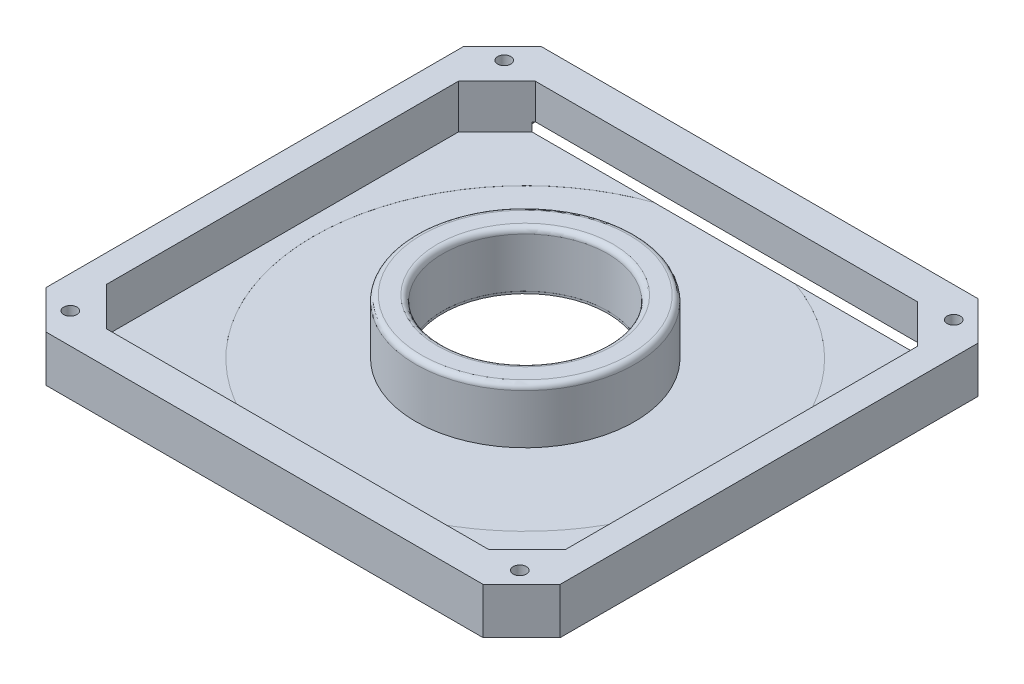
ISO-10303-21;
HEADER;
FILE_DESCRIPTION(('STEP AP214'),'2;1');
FILE_NAME('part.step','',(''),(''),'','','');
FILE_SCHEMA(('AUTOMOTIVE_DESIGN { 1 0 10303 214 1 1 1 1 }'));
ENDSEC;
DATA;
#1=APPLICATION_CONTEXT('core data for automotive mechanical design processes');
#2=APPLICATION_PROTOCOL_DEFINITION('international standard','automotive_design',2000,#1);
#3=PRODUCT_CONTEXT('',#1,'mechanical');
#4=PRODUCT('Part','Part','',(#3));
#5=PRODUCT_RELATED_PRODUCT_CATEGORY('part','',(#4));
#6=PRODUCT_DEFINITION_FORMATION('','',#4);
#7=PRODUCT_DEFINITION_CONTEXT('part definition',#1,'design');
#8=PRODUCT_DEFINITION('design','',#6,#7);
#9=PRODUCT_DEFINITION_SHAPE('','',#8);
#10=(LENGTH_UNIT() NAMED_UNIT(*) SI_UNIT(.MILLI.,.METRE.));
#11=(NAMED_UNIT(*) PLANE_ANGLE_UNIT() SI_UNIT($,.RADIAN.));
#12=(NAMED_UNIT(*) SI_UNIT($,.STERADIAN.) SOLID_ANGLE_UNIT());
#13=UNCERTAINTY_MEASURE_WITH_UNIT(LENGTH_MEASURE(1.E-05),#10,'distance_accuracy_value','');
#14=(GEOMETRIC_REPRESENTATION_CONTEXT(3) GLOBAL_UNCERTAINTY_ASSIGNED_CONTEXT((#13)) GLOBAL_UNIT_ASSIGNED_CONTEXT((#10,
#11,#12)) REPRESENTATION_CONTEXT('',''));
#15=CARTESIAN_POINT('',(0.,0.,0.));
#16=DIRECTION('',(0.,0.,1.));
#17=DIRECTION('',(1.,0.,0.));
#18=AXIS2_PLACEMENT_3D('',#15,#16,#17);
#19=CARTESIAN_POINT('',(-39.75,8.4,-45.));
#20=DIRECTION('',(0.,0.,1.));
#21=DIRECTION('',(1.,0.,0.));
#22=AXIS2_PLACEMENT_3D('',#19,#20,#21);
#23=PLANE('',#22);
#24=DIRECTION('',(0.,1.,0.));
#25=VECTOR('',#24,1.);
#26=CARTESIAN_POINT('',(-36.75,-162.561574872416,-45.));
#27=LINE('',#26,#25);
#28=CARTESIAN_POINT('',(-36.75,0.,-45.));
#29=VERTEX_POINT('',#28);
#30=CARTESIAN_POINT('',(-36.75,1.99999999999997,-45.));
#31=VERTEX_POINT('',#30);
#32=EDGE_CURVE('E322',#29,#31,#27,.T.);
#33=ORIENTED_EDGE('',*,*,#32,.F.);
#34=DIRECTION('',(-1.,0.,0.));
#35=VECTOR('',#34,1.);
#36=CARTESIAN_POINT('',(-39.75,0.,-45.));
#37=LINE('',#36,#35);
#38=CARTESIAN_POINT('',(-39.75,0.,-45.));
#39=VERTEX_POINT('',#38);
#40=EDGE_CURVE('E281',#29,#39,#37,.T.);
#41=ORIENTED_EDGE('',*,*,#40,.T.);
#42=DIRECTION('',(0.,-1.,0.));
#43=VECTOR('',#42,1.);
#44=CARTESIAN_POINT('',(-39.75,8.4,-45.));
#45=LINE('',#44,#43);
#46=CARTESIAN_POINT('',(-39.75,8.4,-45.));
#47=VERTEX_POINT('',#46);
#48=EDGE_CURVE('E282',#47,#39,#45,.T.);
#49=ORIENTED_EDGE('',*,*,#48,.F.);
#50=DIRECTION('',(-1.,0.,0.));
#51=VECTOR('',#50,1.);
#52=CARTESIAN_POINT('',(-39.75,8.4,-45.));
#53=LINE('',#52,#51);
#54=CARTESIAN_POINT('',(39.75,8.4,-45.));
#55=VERTEX_POINT('',#54);
#56=EDGE_CURVE('E305',#55,#47,#53,.T.);
#57=ORIENTED_EDGE('',*,*,#56,.F.);
#58=DIRECTION('',(0.,-1.,0.));
#59=VECTOR('',#58,1.);
#60=CARTESIAN_POINT('',(39.75,8.4,-45.));
#61=LINE('',#60,#59);
#62=CARTESIAN_POINT('',(39.75,0.,-45.));
#63=VERTEX_POINT('',#62);
#64=EDGE_CURVE('E277',#55,#63,#61,.T.);
#65=ORIENTED_EDGE('',*,*,#64,.T.);
#66=CARTESIAN_POINT('',(36.75,0.,-45.));
#67=VERTEX_POINT('',#66);
#68=EDGE_CURVE('E280',#63,#67,#37,.T.);
#69=ORIENTED_EDGE('',*,*,#68,.T.);
#70=DIRECTION('',(0.,1.,0.));
#71=VECTOR('',#70,1.);
#72=CARTESIAN_POINT('',(36.75,-162.561574872416,-45.));
#73=LINE('',#72,#71);
#74=CARTESIAN_POINT('',(36.75,1.99999999999997,-45.));
#75=VERTEX_POINT('',#74);
#76=EDGE_CURVE('E293',#67,#75,#73,.T.);
#77=ORIENTED_EDGE('',*,*,#76,.T.);
#78=DIRECTION('',(-1.,0.,0.));
#79=VECTOR('',#78,1.);
#80=CARTESIAN_POINT('',(-39.75,2.,-45.));
#81=LINE('',#80,#79);
#82=EDGE_CURVE('E301',#75,#31,#81,.T.);
#83=ORIENTED_EDGE('',*,*,#82,.T.);
#84=EDGE_LOOP('',(#33,#41,#49,#57,#65,#69,#77,#83));
#85=FACE_BOUND('',#84,.T.);
#86=ADVANCED_FACE('F44',(#85),#23,.F.);
#87=CARTESIAN_POINT('',(0.,0.,0.));
#88=DIRECTION('',(0.,-1.,0.));
#89=DIRECTION('',(0.,0.,-1.));
#90=AXIS2_PLACEMENT_3D('',#87,#88,#89);
#91=PLANE('',#90);
#92=CARTESIAN_POINT('',(0.,0.,-2.404788));
#93=DIRECTION('',(0.,1.,0.));
#94=DIRECTION('',(0.,0.,1.));
#95=AXIS2_PLACEMENT_3D('',#92,#93,#94);
#96=CIRCLE('',#95,15.);
#97=CARTESIAN_POINT('',(0.,0.,12.595212));
#98=VERTEX_POINT('',#97);
#99=EDGE_CURVE('E520',#98,#98,#96,.T.);
#100=ORIENTED_EDGE('',*,*,#99,.T.);
#101=EDGE_LOOP('',(#100));
#102=FACE_BOUND('',#101,.T.);
#103=CARTESIAN_POINT('',(40.8711804126844,0.,39.4578599479724));
#104=DIRECTION('',(0.,-1.,0.));
#105=DIRECTION('',(0.,0.,-1.));
#106=AXIS2_PLACEMENT_3D('',#103,#104,#105);
#107=CIRCLE('',#106,1.19999999999999);
#108=CARTESIAN_POINT('',(40.8711804126844,0.,38.2578599479724));
#109=VERTEX_POINT('',#108);
#110=EDGE_CURVE('E514',#109,#109,#107,.T.);
#111=ORIENTED_EDGE('',*,*,#110,.F.);
#112=EDGE_LOOP('',(#111));
#113=FACE_BOUND('',#112,.T.);
#114=CARTESIAN_POINT('',(-40.8711804126844,0.,39.4578599479724));
#115=DIRECTION('',(0.,-1.,0.));
#116=DIRECTION('',(0.,0.,-1.));
#117=AXIS2_PLACEMENT_3D('',#114,#115,#116);
#118=CIRCLE('',#117,1.19999999999999);
#119=CARTESIAN_POINT('',(-40.8711804126844,0.,38.2578599479724));
#120=VERTEX_POINT('',#119);
#121=EDGE_CURVE('E508',#120,#120,#118,.T.);
#122=ORIENTED_EDGE('',*,*,#121,.F.);
#123=EDGE_LOOP('',(#122));
#124=FACE_BOUND('',#123,.T.);
#125=CARTESIAN_POINT('',(-40.8711804126844,0.,-39.4578599479724));
#126=DIRECTION('',(0.,-1.,0.));
#127=DIRECTION('',(0.,0.,-1.));
#128=AXIS2_PLACEMENT_3D('',#125,#126,#127);
#129=CIRCLE('',#128,1.19999999999999);
#130=CARTESIAN_POINT('',(-40.8711804126844,0.,-40.6578599479724));
#131=VERTEX_POINT('',#130);
#132=EDGE_CURVE('E500',#131,#131,#129,.T.);
#133=ORIENTED_EDGE('',*,*,#132,.F.);
#134=EDGE_LOOP('',(#133));
#135=FACE_BOUND('',#134,.T.);
#136=CARTESIAN_POINT('',(40.8711804126844,0.,-39.4578599479724));
#137=DIRECTION('',(0.,-1.,0.));
#138=DIRECTION('',(0.,0.,-1.));
#139=AXIS2_PLACEMENT_3D('',#136,#137,#138);
#140=CIRCLE('',#139,1.19999999999999);
#141=CARTESIAN_POINT('',(40.8711804126844,0.,-40.6578599479724));
#142=VERTEX_POINT('',#141);
#143=EDGE_CURVE('E494',#142,#142,#140,.T.);
#144=ORIENTED_EDGE('',*,*,#143,.F.);
#145=EDGE_LOOP('',(#144));
#146=FACE_BOUND('',#145,.T.);
#147=ORIENTED_EDGE('',*,*,#40,.F.);
#148=DIRECTION('',(0.,0.,-1.));
#149=VECTOR('',#148,1.);
#150=CARTESIAN_POINT('',(-36.75,0.,-39.7047880243918));
#151=LINE('',#150,#149);
#152=CARTESIAN_POINT('',(-36.75,0.,-39.7047880243918));
#153=VERTEX_POINT('',#152);
#154=EDGE_CURVE('E304',#153,#29,#151,.T.);
#155=ORIENTED_EDGE('',*,*,#154,.F.);
#156=CARTESIAN_POINT('',(-35.75,0.,-39.7047880243918));
#157=DIRECTION('',(0.,-1.,0.));
#158=DIRECTION('',(0.,0.,-1.));
#159=AXIS2_PLACEMENT_3D('',#156,#157,#158);
#160=CIRCLE('',#159,0.999999999999997);
#161=CARTESIAN_POINT('',(-35.75,0.,-38.7047880243918));
#162=VERTEX_POINT('',#161);
#163=EDGE_CURVE('E326',#162,#153,#160,.T.);
#164=ORIENTED_EDGE('',*,*,#163,.F.);
#165=DIRECTION('',(-1.,0.,0.));
#166=VECTOR('',#165,1.);
#167=CARTESIAN_POINT('',(35.75,0.,-38.7047880243918));
#168=LINE('',#167,#166);
#169=CARTESIAN_POINT('',(35.75,0.,-38.7047880243918));
#170=VERTEX_POINT('',#169);
#171=EDGE_CURVE('E333',#170,#162,#168,.T.);
#172=ORIENTED_EDGE('',*,*,#171,.F.);
#173=CARTESIAN_POINT('',(35.75,0.,-39.7047880243918));
#174=DIRECTION('',(0.,-1.,0.));
#175=DIRECTION('',(0.,0.,-1.));
#176=AXIS2_PLACEMENT_3D('',#173,#174,#175);
#177=CIRCLE('',#176,1.);
#178=CARTESIAN_POINT('',(36.75,0.,-39.7047880243918));
#179=VERTEX_POINT('',#178);
#180=EDGE_CURVE('E332',#179,#170,#177,.T.);
#181=ORIENTED_EDGE('',*,*,#180,.F.);
#182=DIRECTION('',(0.,0.,1.));
#183=VECTOR('',#182,1.);
#184=CARTESIAN_POINT('',(36.75,0.,-45.));
#185=LINE('',#184,#183);
#186=EDGE_CURVE('E337',#67,#179,#185,.T.);
#187=ORIENTED_EDGE('',*,*,#186,.F.);
#188=ORIENTED_EDGE('',*,*,#68,.F.);
#189=DIRECTION('',(-0.707106781186547,0.,-0.707106781186547));
#190=VECTOR('',#189,1.);
#191=CARTESIAN_POINT('',(39.75,0.,-45.));
#192=LINE('',#191,#190);
#193=CARTESIAN_POINT('',(46.75,0.,-38.));
#194=VERTEX_POINT('',#193);
#195=EDGE_CURVE('E272',#194,#63,#192,.T.);
#196=ORIENTED_EDGE('',*,*,#195,.F.);
#197=DIRECTION('',(0.,0.,-1.));
#198=VECTOR('',#197,1.);
#199=CARTESIAN_POINT('',(46.75,0.,38.));
#200=LINE('',#199,#198);
#201=CARTESIAN_POINT('',(46.75,0.,38.));
#202=VERTEX_POINT('',#201);
#203=EDGE_CURVE('E268',#202,#194,#200,.T.);
#204=ORIENTED_EDGE('',*,*,#203,.F.);
#205=DIRECTION('',(0.707106781186548,0.,-0.707106781186547));
#206=VECTOR('',#205,1.);
#207=CARTESIAN_POINT('',(39.75,0.,45.));
#208=LINE('',#207,#206);
#209=CARTESIAN_POINT('',(39.75,0.,45.));
#210=VERTEX_POINT('',#209);
#211=EDGE_CURVE('E264',#210,#202,#208,.T.);
#212=ORIENTED_EDGE('',*,*,#211,.F.);
#213=DIRECTION('',(1.,0.,0.));
#214=VECTOR('',#213,1.);
#215=CARTESIAN_POINT('',(-39.75,0.,45.));
#216=LINE('',#215,#214);
#217=CARTESIAN_POINT('',(-39.75,0.,45.));
#218=VERTEX_POINT('',#217);
#219=EDGE_CURVE('E259',#218,#210,#216,.T.);
#220=ORIENTED_EDGE('',*,*,#219,.F.);
#221=DIRECTION('',(0.707106781186547,0.,0.707106781186547));
#222=VECTOR('',#221,1.);
#223=CARTESIAN_POINT('',(-39.75,0.,45.));
#224=LINE('',#223,#222);
#225=CARTESIAN_POINT('',(-46.75,0.,38.));
#226=VERTEX_POINT('',#225);
#227=EDGE_CURVE('E260',#226,#218,#224,.T.);
#228=ORIENTED_EDGE('',*,*,#227,.F.);
#229=DIRECTION('',(0.,0.,1.));
#230=VECTOR('',#229,1.);
#231=CARTESIAN_POINT('',(-46.75,0.,38.));
#232=LINE('',#231,#230);
#233=CARTESIAN_POINT('',(-46.75,0.,-38.));
#234=VERTEX_POINT('',#233);
#235=EDGE_CURVE('E289',#234,#226,#232,.T.);
#236=ORIENTED_EDGE('',*,*,#235,.F.);
#237=DIRECTION('',(-0.707106781186547,0.,0.707106781186547));
#238=VECTOR('',#237,1.);
#239=CARTESIAN_POINT('',(-46.75,0.,-38.));
#240=LINE('',#239,#238);
#241=EDGE_CURVE('E276',#39,#234,#240,.T.);
#242=ORIENTED_EDGE('',*,*,#241,.F.);
#243=EDGE_LOOP('',(#147,#155,#164,#172,#181,#187,#188,#196,#204,#212,#220,#228,#236,#242));
#244=FACE_BOUND('',#243,.T.);
#245=ADVANCED_FACE('F453',(#102,#113,#124,#135,#146,#244),#91,.T.);
#246=CARTESIAN_POINT('',(-46.75,8.4,38.));
#247=DIRECTION('',(1.,0.,0.));
#248=DIRECTION('',(0.,0.,-1.));
#249=AXIS2_PLACEMENT_3D('',#246,#247,#248);
#250=PLANE('',#249);
#251=ORIENTED_EDGE('',*,*,#235,.T.);
#252=DIRECTION('',(0.,-1.,0.));
#253=VECTOR('',#252,1.);
#254=CARTESIAN_POINT('',(-46.75,8.4,38.));
#255=LINE('',#254,#253);
#256=CARTESIAN_POINT('',(-46.75,8.4,38.));
#257=VERTEX_POINT('',#256);
#258=EDGE_CURVE('E256',#257,#226,#255,.T.);
#259=ORIENTED_EDGE('',*,*,#258,.F.);
#260=DIRECTION('',(0.,0.,1.));
#261=VECTOR('',#260,1.);
#262=CARTESIAN_POINT('',(-46.75,8.4,38.));
#263=LINE('',#262,#261);
#264=CARTESIAN_POINT('',(-46.75,8.4,-38.));
#265=VERTEX_POINT('',#264);
#266=EDGE_CURVE('E285',#265,#257,#263,.T.);
#267=ORIENTED_EDGE('',*,*,#266,.F.);
#268=DIRECTION('',(0.,-1.,0.));
#269=VECTOR('',#268,1.);
#270=CARTESIAN_POINT('',(-46.75,8.4,-38.));
#271=LINE('',#270,#269);
#272=EDGE_CURVE('E286',#265,#234,#271,.T.);
#273=ORIENTED_EDGE('',*,*,#272,.T.);
#274=EDGE_LOOP('',(#251,#259,#267,#273));
#275=FACE_BOUND('',#274,.T.);
#276=ADVANCED_FACE('F487',(#275),#250,.F.);
#277=CARTESIAN_POINT('',(-39.75,8.4,45.));
#278=DIRECTION('',(0.707106781186548,0.,-0.707106781186548));
#279=DIRECTION('',(-0.707106781186548,0.,-0.707106781186548));
#280=AXIS2_PLACEMENT_3D('',#277,#278,#279);
#281=PLANE('',#280);
#282=ORIENTED_EDGE('',*,*,#227,.T.);
#283=DIRECTION('',(0.,-1.,0.));
#284=VECTOR('',#283,1.);
#285=CARTESIAN_POINT('',(-39.75,8.4,45.));
#286=LINE('',#285,#284);
#287=CARTESIAN_POINT('',(-39.75,8.4,45.));
#288=VERTEX_POINT('',#287);
#289=EDGE_CURVE('E261',#288,#218,#286,.T.);
#290=ORIENTED_EDGE('',*,*,#289,.F.);
#291=DIRECTION('',(0.707106781186547,0.,0.707106781186547));
#292=VECTOR('',#291,1.);
#293=CARTESIAN_POINT('',(-39.75,8.4,45.));
#294=LINE('',#293,#292);
#295=EDGE_CURVE('E315',#257,#288,#294,.T.);
#296=ORIENTED_EDGE('',*,*,#295,.F.);
#297=ORIENTED_EDGE('',*,*,#258,.T.);
#298=EDGE_LOOP('',(#282,#290,#296,#297));
#299=FACE_BOUND('',#298,.T.);
#300=ADVANCED_FACE('F484',(#299),#281,.F.);
#301=CARTESIAN_POINT('',(-39.75,8.4,45.));
#302=DIRECTION('',(0.,0.,-1.));
#303=DIRECTION('',(-1.,0.,0.));
#304=AXIS2_PLACEMENT_3D('',#301,#302,#303);
#305=PLANE('',#304);
#306=ORIENTED_EDGE('',*,*,#219,.T.);
#307=DIRECTION('',(0.,-1.,0.));
#308=VECTOR('',#307,1.);
#309=CARTESIAN_POINT('',(39.75,8.4,45.));
#310=LINE('',#309,#308);
#311=CARTESIAN_POINT('',(39.75,8.4,45.));
#312=VERTEX_POINT('',#311);
#313=EDGE_CURVE('E265',#312,#210,#310,.T.);
#314=ORIENTED_EDGE('',*,*,#313,.F.);
#315=DIRECTION('',(1.,0.,0.));
#316=VECTOR('',#315,1.);
#317=CARTESIAN_POINT('',(-39.75,8.4,45.));
#318=LINE('',#317,#316);
#319=EDGE_CURVE('E313',#288,#312,#318,.T.);
#320=ORIENTED_EDGE('',*,*,#319,.F.);
#321=ORIENTED_EDGE('',*,*,#289,.T.);
#322=EDGE_LOOP('',(#306,#314,#320,#321));
#323=FACE_BOUND('',#322,.T.);
#324=ADVANCED_FACE('F478',(#323),#305,.F.);
#325=CARTESIAN_POINT('',(39.75,8.4,45.));
#326=DIRECTION('',(-0.707106781186547,0.,-0.707106781186548));
#327=DIRECTION('',(-0.707106781186548,0.,0.707106781186547));
#328=AXIS2_PLACEMENT_3D('',#325,#326,#327);
#329=PLANE('',#328);
#330=ORIENTED_EDGE('',*,*,#211,.T.);
#331=DIRECTION('',(0.,-1.,0.));
#332=VECTOR('',#331,1.);
#333=CARTESIAN_POINT('',(46.75,8.4,38.));
#334=LINE('',#333,#332);
#335=CARTESIAN_POINT('',(46.75,8.4,38.));
#336=VERTEX_POINT('',#335);
#337=EDGE_CURVE('E269',#336,#202,#334,.T.);
#338=ORIENTED_EDGE('',*,*,#337,.F.);
#339=DIRECTION('',(0.707106781186548,0.,-0.707106781186547));
#340=VECTOR('',#339,1.);
#341=CARTESIAN_POINT('',(39.75,8.4,45.));
#342=LINE('',#341,#340);
#343=EDGE_CURVE('E311',#312,#336,#342,.T.);
#344=ORIENTED_EDGE('',*,*,#343,.F.);
#345=ORIENTED_EDGE('',*,*,#313,.T.);
#346=EDGE_LOOP('',(#330,#338,#344,#345));
#347=FACE_BOUND('',#346,.T.);
#348=ADVANCED_FACE('F474',(#347),#329,.F.);
#349=CARTESIAN_POINT('',(46.75,8.4,38.));
#350=DIRECTION('',(-1.,0.,0.));
#351=DIRECTION('',(0.,0.,1.));
#352=AXIS2_PLACEMENT_3D('',#349,#350,#351);
#353=PLANE('',#352);
#354=ORIENTED_EDGE('',*,*,#203,.T.);
#355=DIRECTION('',(0.,-1.,0.));
#356=VECTOR('',#355,1.);
#357=CARTESIAN_POINT('',(46.75,8.4,-38.));
#358=LINE('',#357,#356);
#359=CARTESIAN_POINT('',(46.75,8.4,-38.));
#360=VERTEX_POINT('',#359);
#361=EDGE_CURVE('E273',#360,#194,#358,.T.);
#362=ORIENTED_EDGE('',*,*,#361,.F.);
#363=DIRECTION('',(0.,0.,-1.));
#364=VECTOR('',#363,1.);
#365=CARTESIAN_POINT('',(46.75,8.4,38.));
#366=LINE('',#365,#364);
#367=EDGE_CURVE('E309',#336,#360,#366,.T.);
#368=ORIENTED_EDGE('',*,*,#367,.F.);
#369=ORIENTED_EDGE('',*,*,#337,.T.);
#370=EDGE_LOOP('',(#354,#362,#368,#369));
#371=FACE_BOUND('',#370,.T.);
#372=ADVANCED_FACE('F469',(#371),#353,.F.);
#373=CARTESIAN_POINT('',(39.75,8.4,-45.));
#374=DIRECTION('',(-0.707106781186548,0.,0.707106781186548));
#375=DIRECTION('',(0.707106781186548,0.,0.707106781186548));
#376=AXIS2_PLACEMENT_3D('',#373,#374,#375);
#377=PLANE('',#376);
#378=ORIENTED_EDGE('',*,*,#195,.T.);
#379=ORIENTED_EDGE('',*,*,#64,.F.);
#380=DIRECTION('',(-0.707106781186547,0.,-0.707106781186547));
#381=VECTOR('',#380,1.);
#382=CARTESIAN_POINT('',(39.75,8.4,-45.));
#383=LINE('',#382,#381);
#384=EDGE_CURVE('E307',#360,#55,#383,.T.);
#385=ORIENTED_EDGE('',*,*,#384,.F.);
#386=ORIENTED_EDGE('',*,*,#361,.T.);
#387=EDGE_LOOP('',(#378,#379,#385,#386));
#388=FACE_BOUND('',#387,.T.);
#389=ADVANCED_FACE('F463',(#388),#377,.F.);
#390=CARTESIAN_POINT('',(-46.75,8.4,-38.));
#391=DIRECTION('',(0.707106781186548,0.,0.707106781186548));
#392=DIRECTION('',(0.707106781186548,0.,-0.707106781186548));
#393=AXIS2_PLACEMENT_3D('',#390,#391,#392);
#394=PLANE('',#393);
#395=ORIENTED_EDGE('',*,*,#241,.T.);
#396=ORIENTED_EDGE('',*,*,#272,.F.);
#397=DIRECTION('',(-0.707106781186547,0.,0.707106781186547));
#398=VECTOR('',#397,1.);
#399=CARTESIAN_POINT('',(-46.75,8.4,-38.));
#400=LINE('',#399,#398);
#401=EDGE_CURVE('E302',#47,#265,#400,.T.);
#402=ORIENTED_EDGE('',*,*,#401,.F.);
#403=ORIENTED_EDGE('',*,*,#48,.T.);
#404=EDGE_LOOP('',(#395,#396,#402,#403));
#405=FACE_BOUND('',#404,.T.);
#406=ADVANCED_FACE('F491',(#405),#394,.F.);
#407=CARTESIAN_POINT('',(0.,8.4,0.));
#408=DIRECTION('',(0.,-1.,0.));
#409=DIRECTION('',(0.,0.,-1.));
#410=AXIS2_PLACEMENT_3D('',#407,#408,#409);
#411=PLANE('',#410);
#412=CARTESIAN_POINT('',(40.8711804126844,8.4,39.4578599479724));
#413=DIRECTION('',(0.,1.,0.));
#414=DIRECTION('',(0.,0.,1.));
#415=AXIS2_PLACEMENT_3D('',#412,#413,#414);
#416=CIRCLE('',#415,1.19999999999999);
#417=CARTESIAN_POINT('',(40.8711804126844,8.4,40.6578599479724));
#418=VERTEX_POINT('',#417);
#419=EDGE_CURVE('E517',#418,#418,#416,.T.);
#420=ORIENTED_EDGE('',*,*,#419,.F.);
#421=EDGE_LOOP('',(#420));
#422=FACE_BOUND('',#421,.T.);
#423=CARTESIAN_POINT('',(-40.8711804126844,8.4,39.4578599479724));
#424=DIRECTION('',(0.,1.,0.));
#425=DIRECTION('',(0.,0.,1.));
#426=AXIS2_PLACEMENT_3D('',#423,#424,#425);
#427=CIRCLE('',#426,1.19999999999999);
#428=CARTESIAN_POINT('',(-40.8711804126844,8.4,40.6578599479724));
#429=VERTEX_POINT('',#428);
#430=EDGE_CURVE('E511',#429,#429,#427,.T.);
#431=ORIENTED_EDGE('',*,*,#430,.F.);
#432=EDGE_LOOP('',(#431));
#433=FACE_BOUND('',#432,.T.);
#434=CARTESIAN_POINT('',(-40.8711804126844,8.4,-39.4578599479724));
#435=DIRECTION('',(0.,1.,0.));
#436=DIRECTION('',(0.,0.,1.));
#437=AXIS2_PLACEMENT_3D('',#434,#435,#436);
#438=CIRCLE('',#437,1.19999999999999);
#439=CARTESIAN_POINT('',(-40.8711804126844,8.4,-38.2578599479724));
#440=VERTEX_POINT('',#439);
#441=EDGE_CURVE('E505',#440,#440,#438,.T.);
#442=ORIENTED_EDGE('',*,*,#441,.F.);
#443=EDGE_LOOP('',(#442));
#444=FACE_BOUND('',#443,.T.);
#445=CARTESIAN_POINT('',(40.8711804126844,8.4,-39.4578599479724));
#446=DIRECTION('',(0.,1.,0.));
#447=DIRECTION('',(0.,0.,1.));
#448=AXIS2_PLACEMENT_3D('',#445,#446,#447);
#449=CIRCLE('',#448,1.19999999999999);
#450=CARTESIAN_POINT('',(40.8711804126844,8.4,-38.2578599479724));
#451=VERTEX_POINT('',#450);
#452=EDGE_CURVE('E496',#451,#451,#449,.T.);
#453=ORIENTED_EDGE('',*,*,#452,.F.);
#454=EDGE_LOOP('',(#453));
#455=FACE_BOUND('',#454,.T.);
#456=DIRECTION('',(0.707106781186547,0.,0.707106781186547));
#457=VECTOR('',#456,1.);
#458=CARTESIAN_POINT('',(-41.75,8.4,32.));
#459=LINE('',#458,#457);
#460=CARTESIAN_POINT('',(-41.75,8.4,32.));
#461=VERTEX_POINT('',#460);
#462=CARTESIAN_POINT('',(-34.75,8.4,39.));
#463=VERTEX_POINT('',#462);
#464=EDGE_CURVE('E238',#461,#463,#459,.T.);
#465=ORIENTED_EDGE('',*,*,#464,.F.);
#466=DIRECTION('',(0.,0.,1.));
#467=VECTOR('',#466,1.);
#468=CARTESIAN_POINT('',(-41.75,8.4,32.));
#469=LINE('',#468,#467);
#470=CARTESIAN_POINT('',(-41.75,8.4,-32.));
#471=VERTEX_POINT('',#470);
#472=EDGE_CURVE('E352',#471,#461,#469,.T.);
#473=ORIENTED_EDGE('',*,*,#472,.F.);
#474=DIRECTION('',(-0.707106781186547,0.,0.707106781186547));
#475=VECTOR('',#474,1.);
#476=CARTESIAN_POINT('',(-41.75,8.4,-32.));
#477=LINE('',#476,#475);
#478=CARTESIAN_POINT('',(-34.75,8.4,-39.));
#479=VERTEX_POINT('',#478);
#480=EDGE_CURVE('E251',#479,#471,#477,.T.);
#481=ORIENTED_EDGE('',*,*,#480,.F.);
#482=DIRECTION('',(-1.,0.,0.));
#483=VECTOR('',#482,1.);
#484=CARTESIAN_POINT('',(-34.75,8.4,-39.));
#485=LINE('',#484,#483);
#486=CARTESIAN_POINT('',(34.75,8.4,-39.));
#487=VERTEX_POINT('',#486);
#488=EDGE_CURVE('E364',#487,#479,#485,.T.);
#489=ORIENTED_EDGE('',*,*,#488,.F.);
#490=DIRECTION('',(-0.707106781186547,0.,-0.707106781186548));
#491=VECTOR('',#490,1.);
#492=CARTESIAN_POINT('',(34.75,8.4,-39.));
#493=LINE('',#492,#491);
#494=CARTESIAN_POINT('',(41.75,8.4,-32.));
#495=VERTEX_POINT('',#494);
#496=EDGE_CURVE('E255',#495,#487,#493,.T.);
#497=ORIENTED_EDGE('',*,*,#496,.F.);
#498=DIRECTION('',(0.,0.,-1.));
#499=VECTOR('',#498,1.);
#500=CARTESIAN_POINT('',(41.75,8.4,32.));
#501=LINE('',#500,#499);
#502=CARTESIAN_POINT('',(41.75,8.4,32.));
#503=VERTEX_POINT('',#502);
#504=EDGE_CURVE('E254',#503,#495,#501,.T.);
#505=ORIENTED_EDGE('',*,*,#504,.F.);
#506=DIRECTION('',(0.707106781186547,0.,-0.707106781186547));
#507=VECTOR('',#506,1.);
#508=CARTESIAN_POINT('',(34.75,8.4,39.));
#509=LINE('',#508,#507);
#510=CARTESIAN_POINT('',(34.75,8.4,39.));
#511=VERTEX_POINT('',#510);
#512=EDGE_CURVE('E371',#511,#503,#509,.T.);
#513=ORIENTED_EDGE('',*,*,#512,.F.);
#514=DIRECTION('',(1.,0.,0.));
#515=VECTOR('',#514,1.);
#516=CARTESIAN_POINT('',(-34.75,8.4,39.));
#517=LINE('',#516,#515);
#518=EDGE_CURVE('E368',#463,#511,#517,.T.);
#519=ORIENTED_EDGE('',*,*,#518,.F.);
#520=EDGE_LOOP('',(#465,#473,#481,#489,#497,#505,#513,#519));
#521=FACE_BOUND('',#520,.T.);
#522=ORIENTED_EDGE('',*,*,#266,.T.);
#523=ORIENTED_EDGE('',*,*,#295,.T.);
#524=ORIENTED_EDGE('',*,*,#319,.T.);
#525=ORIENTED_EDGE('',*,*,#343,.T.);
#526=ORIENTED_EDGE('',*,*,#367,.T.);
#527=ORIENTED_EDGE('',*,*,#384,.T.);
#528=ORIENTED_EDGE('',*,*,#56,.T.);
#529=ORIENTED_EDGE('',*,*,#401,.T.);
#530=EDGE_LOOP('',(#522,#523,#524,#525,#526,#527,#528,#529));
#531=FACE_BOUND('',#530,.T.);
#532=ADVANCED_FACE('F540',(#422,#433,#444,#455,#521,#531),#411,.F.);
#533=CARTESIAN_POINT('',(-36.75,-162.561574872416,-39.7047880243918));
#534=DIRECTION('',(1.,0.,0.));
#535=DIRECTION('',(0.,0.,-1.));
#536=AXIS2_PLACEMENT_3D('',#533,#534,#535);
#537=PLANE('',#536);
#538=DIRECTION('',(0.,1.,0.));
#539=VECTOR('',#538,1.);
#540=CARTESIAN_POINT('',(-36.75,-162.561574872416,-39.7047880243918));
#541=LINE('',#540,#539);
#542=CARTESIAN_POINT('',(-36.75,1.99999999999997,-39.7047880243918));
#543=VERTEX_POINT('',#542);
#544=EDGE_CURVE('E323',#153,#543,#541,.T.);
#545=ORIENTED_EDGE('',*,*,#544,.F.);
#546=ORIENTED_EDGE('',*,*,#154,.T.);
#547=ORIENTED_EDGE('',*,*,#32,.T.);
#548=DIRECTION('',(0.,0.,-1.));
#549=VECTOR('',#548,1.);
#550=CARTESIAN_POINT('',(-36.75,2.,-39.7047880243918));
#551=LINE('',#550,#549);
#552=EDGE_CURVE('E344',#543,#31,#551,.T.);
#553=ORIENTED_EDGE('',*,*,#552,.F.);
#554=EDGE_LOOP('',(#545,#546,#547,#553));
#555=FACE_BOUND('',#554,.T.);
#556=ADVANCED_FACE('F551',(#555),#537,.T.);
#557=CARTESIAN_POINT('',(-35.75,-162.561574872416,-39.7047880243918));
#558=DIRECTION('',(0.,1.,0.));
#559=DIRECTION('',(0.,0.,1.));
#560=AXIS2_PLACEMENT_3D('',#557,#558,#559);
#561=CYLINDRICAL_SURFACE('',#560,0.999999999999997);
#562=DIRECTION('',(0.,1.,0.));
#563=VECTOR('',#562,1.);
#564=CARTESIAN_POINT('',(-35.75,-162.561574872416,-38.7047880243918));
#565=LINE('',#564,#563);
#566=CARTESIAN_POINT('',(-35.75,1.99999999999997,-38.7047880243918));
#567=VERTEX_POINT('',#566);
#568=EDGE_CURVE('E329',#162,#567,#565,.T.);
#569=ORIENTED_EDGE('',*,*,#568,.F.);
#570=ORIENTED_EDGE('',*,*,#163,.T.);
#571=ORIENTED_EDGE('',*,*,#544,.T.);
#572=CARTESIAN_POINT('',(-35.75,2.,-39.7047880243918));
#573=DIRECTION('',(0.,-1.,0.));
#574=DIRECTION('',(0.,0.,-1.));
#575=AXIS2_PLACEMENT_3D('',#572,#573,#574);
#576=CIRCLE('',#575,0.999999999999997);
#577=EDGE_CURVE('E347',#567,#543,#576,.T.);
#578=ORIENTED_EDGE('',*,*,#577,.F.);
#579=EDGE_LOOP('',(#569,#570,#571,#578));
#580=FACE_BOUND('',#579,.T.);
#581=ADVANCED_FACE('F547',(#580),#561,.F.);
#582=CARTESIAN_POINT('',(35.75,-162.561574872416,-38.7047880243918));
#583=DIRECTION('',(0.,0.,-1.));
#584=DIRECTION('',(-1.,0.,0.));
#585=AXIS2_PLACEMENT_3D('',#582,#583,#584);
#586=PLANE('',#585);
#587=DIRECTION('',(0.,1.,0.));
#588=VECTOR('',#587,1.);
#589=CARTESIAN_POINT('',(-12.8280940996376,0.390000000000001,-38.7047880243918));
#590=LINE('',#589,#588);
#591=CARTESIAN_POINT('',(-12.8280940996376,0.390000000000001,-38.7047880243918));
#592=VERTEX_POINT('',#591);
#593=CARTESIAN_POINT('',(-12.8280940996376,0.400000000000001,-38.7047880243918));
#594=VERTEX_POINT('',#593);
#595=EDGE_CURVE('E213',#592,#594,#590,.T.);
#596=ORIENTED_EDGE('',*,*,#595,.F.);
#597=DIRECTION('',(1.,0.,0.));
#598=VECTOR('',#597,1.);
#599=CARTESIAN_POINT('',(35.75,0.390000000000001,-38.7047880243918));
#600=LINE('',#599,#598);
#601=CARTESIAN_POINT('',(12.8280940996376,0.390000000000001,-38.7047880243918));
#602=VERTEX_POINT('',#601);
#603=EDGE_CURVE('E60',#592,#602,#600,.T.);
#604=ORIENTED_EDGE('',*,*,#603,.T.);
#605=DIRECTION('',(0.,1.,0.));
#606=VECTOR('',#605,1.);
#607=CARTESIAN_POINT('',(12.8280940996376,0.390000000000001,-38.7047880243918));
#608=LINE('',#607,#606);
#609=CARTESIAN_POINT('',(12.8280940996376,0.400000000000001,-38.7047880243918));
#610=VERTEX_POINT('',#609);
#611=EDGE_CURVE('E54',#610,#602,#608,.F.);
#612=ORIENTED_EDGE('',*,*,#611,.F.);
#613=DIRECTION('',(-1.,0.,0.));
#614=VECTOR('',#613,1.);
#615=CARTESIAN_POINT('',(35.75,0.400000000000011,-38.7047880243918));
#616=LINE('',#615,#614);
#617=CARTESIAN_POINT('',(35.0452119756082,0.400000000000006,-38.7047880243918));
#618=VERTEX_POINT('',#617);
#619=EDGE_CURVE('E226',#618,#610,#616,.T.);
#620=ORIENTED_EDGE('',*,*,#619,.F.);
#621=DIRECTION('',(0.,-1.,0.));
#622=VECTOR('',#621,1.);
#623=CARTESIAN_POINT('',(35.0452119756082,-162.561574872416,-38.7047880243918));
#624=LINE('',#623,#622);
#625=CARTESIAN_POINT('',(35.0452119756082,2.,-38.7047880243918));
#626=VERTEX_POINT('',#625);
#627=EDGE_CURVE('E362',#626,#618,#624,.T.);
#628=ORIENTED_EDGE('',*,*,#627,.F.);
#629=DIRECTION('',(-1.,0.,0.));
#630=VECTOR('',#629,1.);
#631=CARTESIAN_POINT('',(35.75,2.,-38.7047880243918));
#632=LINE('',#631,#630);
#633=CARTESIAN_POINT('',(35.75,1.99999999999997,-38.7047880243918));
#634=VERTEX_POINT('',#633);
#635=EDGE_CURVE('E349',#634,#626,#632,.T.);
#636=ORIENTED_EDGE('',*,*,#635,.F.);
#637=DIRECTION('',(0.,1.,0.));
#638=VECTOR('',#637,1.);
#639=CARTESIAN_POINT('',(35.75,-162.561574872416,-38.7047880243918));
#640=LINE('',#639,#638);
#641=EDGE_CURVE('E334',#170,#634,#640,.T.);
#642=ORIENTED_EDGE('',*,*,#641,.F.);
#643=ORIENTED_EDGE('',*,*,#171,.T.);
#644=ORIENTED_EDGE('',*,*,#568,.T.);
#645=CARTESIAN_POINT('',(-35.0452119756082,2.,-38.7047880243918));
#646=VERTEX_POINT('',#645);
#647=EDGE_CURVE('E341',#646,#567,#632,.T.);
#648=ORIENTED_EDGE('',*,*,#647,.F.);
#649=DIRECTION('',(0.,1.,0.));
#650=VECTOR('',#649,1.);
#651=CARTESIAN_POINT('',(-35.0452119756082,-162.561574872416,-38.7047880243918));
#652=LINE('',#651,#650);
#653=CARTESIAN_POINT('',(-35.0452119756082,0.400000000000006,-38.7047880243918));
#654=VERTEX_POINT('',#653);
#655=EDGE_CURVE('E246',#654,#646,#652,.T.);
#656=ORIENTED_EDGE('',*,*,#655,.F.);
#657=EDGE_CURVE('E233',#594,#654,#616,.T.);
#658=ORIENTED_EDGE('',*,*,#657,.F.);
#659=EDGE_LOOP('',(#596,#604,#612,#620,#628,#636,#642,#643,#644,#648,#656,#658));
#660=FACE_BOUND('',#659,.T.);
#661=ADVANCED_FACE('F224',(#660),#586,.T.);
#662=CARTESIAN_POINT('',(35.75,-162.561574872416,-39.7047880243918));
#663=DIRECTION('',(0.,1.,0.));
#664=DIRECTION('',(0.,0.,1.));
#665=AXIS2_PLACEMENT_3D('',#662,#663,#664);
#666=CYLINDRICAL_SURFACE('',#665,1.);
#667=DIRECTION('',(0.,1.,0.));
#668=VECTOR('',#667,1.);
#669=CARTESIAN_POINT('',(36.75,-162.561574872416,-39.7047880243918));
#670=LINE('',#669,#668);
#671=CARTESIAN_POINT('',(36.75,1.99999999999997,-39.7047880243918));
#672=VERTEX_POINT('',#671);
#673=EDGE_CURVE('E338',#179,#672,#670,.T.);
#674=ORIENTED_EDGE('',*,*,#673,.F.);
#675=ORIENTED_EDGE('',*,*,#180,.T.);
#676=ORIENTED_EDGE('',*,*,#641,.T.);
#677=CARTESIAN_POINT('',(35.75,2.,-39.7047880243918));
#678=DIRECTION('',(0.,-1.,0.));
#679=DIRECTION('',(0.,0.,-1.));
#680=AXIS2_PLACEMENT_3D('',#677,#678,#679);
#681=CIRCLE('',#680,1.);
#682=EDGE_CURVE('E353',#672,#634,#681,.T.);
#683=ORIENTED_EDGE('',*,*,#682,.F.);
#684=EDGE_LOOP('',(#674,#675,#676,#683));
#685=FACE_BOUND('',#684,.T.);
#686=ADVANCED_FACE('F445',(#685),#666,.F.);
#687=CARTESIAN_POINT('',(36.75,-162.561574872416,-45.));
#688=DIRECTION('',(-1.,0.,0.));
#689=DIRECTION('',(0.,0.,1.));
#690=AXIS2_PLACEMENT_3D('',#687,#688,#689);
#691=PLANE('',#690);
#692=ORIENTED_EDGE('',*,*,#76,.F.);
#693=ORIENTED_EDGE('',*,*,#186,.T.);
#694=ORIENTED_EDGE('',*,*,#673,.T.);
#695=DIRECTION('',(0.,0.,1.));
#696=VECTOR('',#695,1.);
#697=CARTESIAN_POINT('',(36.75,2.,-45.));
#698=LINE('',#697,#696);
#699=EDGE_CURVE('E346',#75,#672,#698,.T.);
#700=ORIENTED_EDGE('',*,*,#699,.F.);
#701=EDGE_LOOP('',(#692,#693,#694,#700));
#702=FACE_BOUND('',#701,.T.);
#703=ADVANCED_FACE('F448',(#702),#691,.T.);
#704=CARTESIAN_POINT('',(0.,2.,0.));
#705=DIRECTION('',(0.,-1.,0.));
#706=DIRECTION('',(0.,0.,-1.));
#707=AXIS2_PLACEMENT_3D('',#704,#705,#706);
#708=PLANE('',#707);
#709=DIRECTION('',(0.707106781186548,0.,-0.707106781186548));
#710=VECTOR('',#709,1.);
#711=CARTESIAN_POINT('',(-36.875,2.,-36.875));
#712=LINE('',#711,#710);
#713=CARTESIAN_POINT('',(-34.75,2.,-39.));
#714=VERTEX_POINT('',#713);
#715=EDGE_CURVE('E243',#646,#714,#712,.T.);
#716=ORIENTED_EDGE('',*,*,#715,.F.);
#717=ORIENTED_EDGE('',*,*,#647,.T.);
#718=ORIENTED_EDGE('',*,*,#577,.T.);
#719=ORIENTED_EDGE('',*,*,#552,.T.);
#720=ORIENTED_EDGE('',*,*,#82,.F.);
#721=ORIENTED_EDGE('',*,*,#699,.T.);
#722=ORIENTED_EDGE('',*,*,#682,.T.);
#723=ORIENTED_EDGE('',*,*,#635,.T.);
#724=DIRECTION('',(0.707106781186547,0.,0.707106781186548));
#725=VECTOR('',#724,1.);
#726=CARTESIAN_POINT('',(36.875,2.,-36.875));
#727=LINE('',#726,#725);
#728=CARTESIAN_POINT('',(34.75,2.,-39.));
#729=VERTEX_POINT('',#728);
#730=EDGE_CURVE('E252',#729,#626,#727,.T.);
#731=ORIENTED_EDGE('',*,*,#730,.F.);
#732=DIRECTION('',(1.,0.,0.));
#733=VECTOR('',#732,1.);
#734=CARTESIAN_POINT('',(0.,2.,-39.));
#735=LINE('',#734,#733);
#736=EDGE_CURVE('E247',#714,#729,#735,.T.);
#737=ORIENTED_EDGE('',*,*,#736,.F.);
#738=EDGE_LOOP('',(#716,#717,#718,#719,#720,#721,#722,#723,#731,#737));
#739=FACE_BOUND('',#738,.T.);
#740=ADVANCED_FACE('F439',(#739),#708,.T.);
#741=CARTESIAN_POINT('',(-41.75,0.400000000000001,32.));
#742=DIRECTION('',(-1.,0.,0.));
#743=DIRECTION('',(0.,0.,1.));
#744=AXIS2_PLACEMENT_3D('',#741,#742,#743);
#745=PLANE('',#744);
#746=ORIENTED_EDGE('',*,*,#472,.T.);
#747=DIRECTION('',(0.,1.,0.));
#748=VECTOR('',#747,1.);
#749=CARTESIAN_POINT('',(-41.75,0.400000000000001,32.));
#750=LINE('',#749,#748);
#751=CARTESIAN_POINT('',(-41.75,0.400000000000001,32.));
#752=VERTEX_POINT('',#751);
#753=EDGE_CURVE('E234',#752,#461,#750,.T.);
#754=ORIENTED_EDGE('',*,*,#753,.F.);
#755=DIRECTION('',(0.,0.,1.));
#756=VECTOR('',#755,1.);
#757=CARTESIAN_POINT('',(-41.75,0.400000000000001,32.));
#758=LINE('',#757,#756);
#759=CARTESIAN_POINT('',(-41.75,0.400000000000001,-32.));
#760=VERTEX_POINT('',#759);
#761=EDGE_CURVE('E394',#760,#752,#758,.T.);
#762=ORIENTED_EDGE('',*,*,#761,.F.);
#763=DIRECTION('',(0.,1.,0.));
#764=VECTOR('',#763,1.);
#765=CARTESIAN_POINT('',(-41.75,0.400000000000001,-32.));
#766=LINE('',#765,#764);
#767=EDGE_CURVE('E361',#760,#471,#766,.T.);
#768=ORIENTED_EDGE('',*,*,#767,.T.);
#769=EDGE_LOOP('',(#746,#754,#762,#768));
#770=FACE_BOUND('',#769,.T.);
#771=ADVANCED_FACE('F414',(#770),#745,.F.);
#772=CARTESIAN_POINT('',(-41.75,0.400000000000001,-32.));
#773=DIRECTION('',(-0.707106781186547,0.,-0.707106781186547));
#774=DIRECTION('',(-0.707106781186548,0.,0.707106781186548));
#775=AXIS2_PLACEMENT_3D('',#772,#773,#774);
#776=PLANE('',#775);
#777=ORIENTED_EDGE('',*,*,#655,.T.);
#778=ORIENTED_EDGE('',*,*,#715,.T.);
#779=DIRECTION('',(0.,1.,0.));
#780=VECTOR('',#779,1.);
#781=CARTESIAN_POINT('',(-34.75,0.400000000000001,-39.));
#782=LINE('',#781,#780);
#783=EDGE_CURVE('E245',#714,#479,#782,.T.);
#784=ORIENTED_EDGE('',*,*,#783,.T.);
#785=ORIENTED_EDGE('',*,*,#480,.T.);
#786=ORIENTED_EDGE('',*,*,#767,.F.);
#787=DIRECTION('',(-0.707106781186547,0.,0.707106781186547));
#788=VECTOR('',#787,1.);
#789=CARTESIAN_POINT('',(-41.75,0.400000000000001,-32.));
#790=LINE('',#789,#788);
#791=EDGE_CURVE('E236',#654,#760,#790,.T.);
#792=ORIENTED_EDGE('',*,*,#791,.F.);
#793=EDGE_LOOP('',(#777,#778,#784,#785,#786,#792));
#794=FACE_BOUND('',#793,.T.);
#795=ADVANCED_FACE('F535',(#794),#776,.F.);
#796=CARTESIAN_POINT('',(-34.75,0.400000000000001,-39.));
#797=DIRECTION('',(0.,0.,-1.));
#798=DIRECTION('',(-1.,0.,0.));
#799=AXIS2_PLACEMENT_3D('',#796,#797,#798);
#800=PLANE('',#799);
#801=ORIENTED_EDGE('',*,*,#736,.T.);
#802=DIRECTION('',(0.,1.,0.));
#803=VECTOR('',#802,1.);
#804=CARTESIAN_POINT('',(34.75,0.400000000000001,-39.));
#805=LINE('',#804,#803);
#806=EDGE_CURVE('E250',#729,#487,#805,.T.);
#807=ORIENTED_EDGE('',*,*,#806,.T.);
#808=ORIENTED_EDGE('',*,*,#488,.T.);
#809=ORIENTED_EDGE('',*,*,#783,.F.);
#810=EDGE_LOOP('',(#801,#807,#808,#809));
#811=FACE_BOUND('',#810,.T.);
#812=ADVANCED_FACE('F543',(#811),#800,.F.);
#813=CARTESIAN_POINT('',(34.75,0.400000000000001,-39.));
#814=DIRECTION('',(0.707106781186548,0.,-0.707106781186547));
#815=DIRECTION('',(-0.707106781186547,0.,-0.707106781186548));
#816=AXIS2_PLACEMENT_3D('',#813,#814,#815);
#817=PLANE('',#816);
#818=ORIENTED_EDGE('',*,*,#627,.T.);
#819=DIRECTION('',(-0.707106781186547,0.,-0.707106781186548));
#820=VECTOR('',#819,1.);
#821=CARTESIAN_POINT('',(34.75,0.400000000000001,-39.));
#822=LINE('',#821,#820);
#823=CARTESIAN_POINT('',(41.75,0.400000000000001,-32.));
#824=VERTEX_POINT('',#823);
#825=EDGE_CURVE('E232',#824,#618,#822,.T.);
#826=ORIENTED_EDGE('',*,*,#825,.F.);
#827=DIRECTION('',(0.,1.,0.));
#828=VECTOR('',#827,1.);
#829=CARTESIAN_POINT('',(41.75,0.400000000000001,-32.));
#830=LINE('',#829,#828);
#831=EDGE_CURVE('E363',#824,#495,#830,.T.);
#832=ORIENTED_EDGE('',*,*,#831,.T.);
#833=ORIENTED_EDGE('',*,*,#496,.T.);
#834=ORIENTED_EDGE('',*,*,#806,.F.);
#835=ORIENTED_EDGE('',*,*,#730,.T.);
#836=EDGE_LOOP('',(#818,#826,#832,#833,#834,#835));
#837=FACE_BOUND('',#836,.T.);
#838=ADVANCED_FACE('F433',(#837),#817,.F.);
#839=CARTESIAN_POINT('',(41.75,0.400000000000001,32.));
#840=DIRECTION('',(1.,0.,0.));
#841=DIRECTION('',(0.,0.,-1.));
#842=AXIS2_PLACEMENT_3D('',#839,#840,#841);
#843=PLANE('',#842);
#844=ORIENTED_EDGE('',*,*,#504,.T.);
#845=ORIENTED_EDGE('',*,*,#831,.F.);
#846=DIRECTION('',(0.,0.,-1.));
#847=VECTOR('',#846,1.);
#848=CARTESIAN_POINT('',(41.75,0.400000000000001,32.));
#849=LINE('',#848,#847);
#850=CARTESIAN_POINT('',(41.75,0.400000000000001,32.));
#851=VERTEX_POINT('',#850);
#852=EDGE_CURVE('E396',#851,#824,#849,.T.);
#853=ORIENTED_EDGE('',*,*,#852,.F.);
#854=DIRECTION('',(0.,1.,0.));
#855=VECTOR('',#854,1.);
#856=CARTESIAN_POINT('',(41.75,0.400000000000001,32.));
#857=LINE('',#856,#855);
#858=EDGE_CURVE('E372',#851,#503,#857,.T.);
#859=ORIENTED_EDGE('',*,*,#858,.T.);
#860=EDGE_LOOP('',(#844,#845,#853,#859));
#861=FACE_BOUND('',#860,.T.);
#862=ADVANCED_FACE('F430',(#861),#843,.F.);
#863=CARTESIAN_POINT('',(34.75,0.400000000000001,39.));
#864=DIRECTION('',(0.707106781186547,0.,0.707106781186547));
#865=DIRECTION('',(0.707106781186548,0.,-0.707106781186548));
#866=AXIS2_PLACEMENT_3D('',#863,#864,#865);
#867=PLANE('',#866);
#868=ORIENTED_EDGE('',*,*,#512,.T.);
#869=ORIENTED_EDGE('',*,*,#858,.F.);
#870=DIRECTION('',(0.707106781186547,0.,-0.707106781186547));
#871=VECTOR('',#870,1.);
#872=CARTESIAN_POINT('',(34.75,0.400000000000001,39.));
#873=LINE('',#872,#871);
#874=CARTESIAN_POINT('',(34.75,0.400000000000001,39.));
#875=VERTEX_POINT('',#874);
#876=EDGE_CURVE('E398',#875,#851,#873,.T.);
#877=ORIENTED_EDGE('',*,*,#876,.F.);
#878=DIRECTION('',(0.,1.,0.));
#879=VECTOR('',#878,1.);
#880=CARTESIAN_POINT('',(34.75,0.400000000000001,39.));
#881=LINE('',#880,#879);
#882=EDGE_CURVE('E369',#875,#511,#881,.T.);
#883=ORIENTED_EDGE('',*,*,#882,.T.);
#884=EDGE_LOOP('',(#868,#869,#877,#883));
#885=FACE_BOUND('',#884,.T.);
#886=ADVANCED_FACE('F426',(#885),#867,.F.);
#887=CARTESIAN_POINT('',(-34.75,0.400000000000001,39.));
#888=DIRECTION('',(0.,0.,1.));
#889=DIRECTION('',(1.,0.,0.));
#890=AXIS2_PLACEMENT_3D('',#887,#888,#889);
#891=PLANE('',#890);
#892=ORIENTED_EDGE('',*,*,#518,.T.);
#893=ORIENTED_EDGE('',*,*,#882,.F.);
#894=DIRECTION('',(1.,0.,0.));
#895=VECTOR('',#894,1.);
#896=CARTESIAN_POINT('',(-34.75,0.400000000000001,39.));
#897=LINE('',#896,#895);
#898=CARTESIAN_POINT('',(-34.75,0.400000000000001,39.));
#899=VERTEX_POINT('',#898);
#900=EDGE_CURVE('E401',#899,#875,#897,.T.);
#901=ORIENTED_EDGE('',*,*,#900,.F.);
#902=DIRECTION('',(0.,1.,0.));
#903=VECTOR('',#902,1.);
#904=CARTESIAN_POINT('',(-34.75,0.400000000000001,39.));
#905=LINE('',#904,#903);
#906=EDGE_CURVE('E366',#899,#463,#905,.T.);
#907=ORIENTED_EDGE('',*,*,#906,.T.);
#908=EDGE_LOOP('',(#892,#893,#901,#907));
#909=FACE_BOUND('',#908,.T.);
#910=ADVANCED_FACE('F422',(#909),#891,.F.);
#911=CARTESIAN_POINT('',(-41.75,0.400000000000001,32.));
#912=DIRECTION('',(-0.707106781186547,0.,0.707106781186547));
#913=DIRECTION('',(0.707106781186548,0.,0.707106781186548));
#914=AXIS2_PLACEMENT_3D('',#911,#912,#913);
#915=PLANE('',#914);
#916=ORIENTED_EDGE('',*,*,#464,.T.);
#917=ORIENTED_EDGE('',*,*,#906,.F.);
#918=DIRECTION('',(0.707106781186547,0.,0.707106781186547));
#919=VECTOR('',#918,1.);
#920=CARTESIAN_POINT('',(-41.75,0.400000000000001,32.));
#921=LINE('',#920,#919);
#922=EDGE_CURVE('E404',#752,#899,#921,.T.);
#923=ORIENTED_EDGE('',*,*,#922,.F.);
#924=ORIENTED_EDGE('',*,*,#753,.T.);
#925=EDGE_LOOP('',(#916,#917,#923,#924));
#926=FACE_BOUND('',#925,.T.);
#927=ADVANCED_FACE('F418',(#926),#915,.F.);
#928=CARTESIAN_POINT('',(0.,0.400000000000001,0.));
#929=DIRECTION('',(0.,-1.,0.));
#930=DIRECTION('',(0.,0.,-1.));
#931=AXIS2_PLACEMENT_3D('',#928,#929,#930);
#932=PLANE('',#931);
#933=ORIENTED_EDGE('',*,*,#619,.T.);
#934=CARTESIAN_POINT('',(0.,0.400000000000001,-2.404788));
#935=DIRECTION('',(0.,1.,0.));
#936=DIRECTION('',(0.,0.,1.));
#937=AXIS2_PLACEMENT_3D('',#934,#935,#936);
#938=CIRCLE('',#937,38.5);
#939=EDGE_CURVE('E215',#594,#610,#938,.T.);
#940=ORIENTED_EDGE('',*,*,#939,.F.);
#941=ORIENTED_EDGE('',*,*,#657,.T.);
#942=ORIENTED_EDGE('',*,*,#791,.T.);
#943=ORIENTED_EDGE('',*,*,#761,.T.);
#944=ORIENTED_EDGE('',*,*,#922,.T.);
#945=ORIENTED_EDGE('',*,*,#900,.T.);
#946=ORIENTED_EDGE('',*,*,#876,.T.);
#947=ORIENTED_EDGE('',*,*,#852,.T.);
#948=ORIENTED_EDGE('',*,*,#825,.T.);
#949=EDGE_LOOP('',(#933,#940,#941,#942,#943,#944,#945,#946,#947,#948));
#950=FACE_BOUND('',#949,.T.);
#951=ADVANCED_FACE('F229',(#950),#932,.F.);
#952=CARTESIAN_POINT('',(0.,0.390000000000001,-2.404788));
#953=DIRECTION('',(0.,1.,0.));
#954=DIRECTION('',(0.,0.,1.));
#955=AXIS2_PLACEMENT_3D('',#952,#953,#954);
#956=CYLINDRICAL_SURFACE('',#955,38.5);
#957=ORIENTED_EDGE('',*,*,#595,.T.);
#958=ORIENTED_EDGE('',*,*,#939,.T.);
#959=ORIENTED_EDGE('',*,*,#611,.T.);
#960=CARTESIAN_POINT('',(0.,0.390000000000001,-2.404788));
#961=DIRECTION('',(0.,1.,0.));
#962=DIRECTION('',(0.,0.,1.));
#963=AXIS2_PLACEMENT_3D('',#960,#961,#962);
#964=CIRCLE('',#963,38.5);
#965=EDGE_CURVE('E12',#592,#602,#964,.T.);
#966=ORIENTED_EDGE('',*,*,#965,.F.);
#967=EDGE_LOOP('',(#957,#958,#959,#966));
#968=FACE_BOUND('',#967,.T.);
#969=ADVANCED_FACE('F217',(#968),#956,.F.);
#970=CARTESIAN_POINT('',(0.,0.390000000000001,-2.404788));
#971=DIRECTION('',(0.,1.,0.));
#972=DIRECTION('',(0.,0.,1.));
#973=AXIS2_PLACEMENT_3D('',#970,#971,#972);
#974=PLANE('',#973);
#975=CARTESIAN_POINT('',(0.,0.390000000000001,-2.404788));
#976=DIRECTION('',(0.,1.,0.));
#977=DIRECTION('',(0.,0.,1.));
#978=AXIS2_PLACEMENT_3D('',#975,#976,#977);
#979=CIRCLE('',#978,15.);
#980=CARTESIAN_POINT('',(0.,0.390000000000001,12.595212));
#981=VERTEX_POINT('',#980);
#982=EDGE_CURVE('E48',#981,#981,#979,.T.);
#983=ORIENTED_EDGE('',*,*,#982,.F.);
#984=EDGE_LOOP('',(#983));
#985=FACE_BOUND('',#984,.T.);
#986=ORIENTED_EDGE('',*,*,#965,.T.);
#987=ORIENTED_EDGE('',*,*,#603,.F.);
#988=EDGE_LOOP('',(#986,#987));
#989=FACE_BOUND('',#988,.T.);
#990=ADVANCED_FACE('F46',(#985,#989),#974,.T.);
#991=CARTESIAN_POINT('',(40.8711804126844,8.4,-39.4578599479724));
#992=DIRECTION('',(0.,1.,0.));
#993=DIRECTION('',(0.,0.,1.));
#994=AXIS2_PLACEMENT_3D('',#991,#992,#993);
#995=CYLINDRICAL_SURFACE('',#994,1.19999999999999);
#996=ORIENTED_EDGE('',*,*,#143,.T.);
#997=EDGE_LOOP('',(#996));
#998=FACE_BOUND('',#997,.T.);
#999=ORIENTED_EDGE('',*,*,#452,.T.);
#1000=EDGE_LOOP('',(#999));
#1001=FACE_BOUND('',#1000,.T.);
#1002=ADVANCED_FACE('F531',(#998,#1001),#995,.F.);
#1003=CARTESIAN_POINT('',(-40.8711804126844,8.4,-39.4578599479724));
#1004=DIRECTION('',(0.,1.,0.));
#1005=DIRECTION('',(0.,0.,1.));
#1006=AXIS2_PLACEMENT_3D('',#1003,#1004,#1005);
#1007=CYLINDRICAL_SURFACE('',#1006,1.19999999999999);
#1008=ORIENTED_EDGE('',*,*,#132,.T.);
#1009=EDGE_LOOP('',(#1008));
#1010=FACE_BOUND('',#1009,.T.);
#1011=ORIENTED_EDGE('',*,*,#441,.T.);
#1012=EDGE_LOOP('',(#1011));
#1013=FACE_BOUND('',#1012,.T.);
#1014=ADVANCED_FACE('F667',(#1010,#1013),#1007,.F.);
#1015=CARTESIAN_POINT('',(-40.8711804126844,8.4,39.4578599479724));
#1016=DIRECTION('',(0.,1.,0.));
#1017=DIRECTION('',(0.,0.,1.));
#1018=AXIS2_PLACEMENT_3D('',#1015,#1016,#1017);
#1019=CYLINDRICAL_SURFACE('',#1018,1.19999999999999);
#1020=ORIENTED_EDGE('',*,*,#121,.T.);
#1021=EDGE_LOOP('',(#1020));
#1022=FACE_BOUND('',#1021,.T.);
#1023=ORIENTED_EDGE('',*,*,#430,.T.);
#1024=EDGE_LOOP('',(#1023));
#1025=FACE_BOUND('',#1024,.T.);
#1026=ADVANCED_FACE('F674',(#1022,#1025),#1019,.F.);
#1027=CARTESIAN_POINT('',(40.8711804126844,8.4,39.4578599479724));
#1028=DIRECTION('',(0.,1.,0.));
#1029=DIRECTION('',(0.,0.,1.));
#1030=AXIS2_PLACEMENT_3D('',#1027,#1028,#1029);
#1031=CYLINDRICAL_SURFACE('',#1030,1.19999999999999);
#1032=ORIENTED_EDGE('',*,*,#110,.T.);
#1033=EDGE_LOOP('',(#1032));
#1034=FACE_BOUND('',#1033,.T.);
#1035=ORIENTED_EDGE('',*,*,#419,.T.);
#1036=EDGE_LOOP('',(#1035));
#1037=FACE_BOUND('',#1036,.T.);
#1038=ADVANCED_FACE('F682',(#1034,#1037),#1031,.F.);
#1039=CARTESIAN_POINT('',(0.,0.,-2.404788));
#1040=DIRECTION('',(0.,1.,0.));
#1041=DIRECTION('',(0.,0.,1.));
#1042=AXIS2_PLACEMENT_3D('',#1039,#1040,#1041);
#1043=CYLINDRICAL_SURFACE('',#1042,15.);
#1044=ORIENTED_EDGE('',*,*,#982,.T.);
#1045=EDGE_LOOP('',(#1044));
#1046=FACE_BOUND('',#1045,.T.);
#1047=ORIENTED_EDGE('',*,*,#99,.F.);
#1048=EDGE_LOOP('',(#1047));
#1049=FACE_BOUND('',#1048,.T.);
#1050=ADVANCED_FACE('F527',(#1046,#1049),#1043,.F.);
#1051=CLOSED_SHELL('',(#86,#245,#276,#300,#324,#348,#372,#389,#406,#532,#556,#581,#661,#686,
#703,#740,#771,#795,#812,#838,#862,#886,#910,#927,#951,#969,#990,#1002,#1014,#1026,#1038,#1050));
#1052=MANIFOLD_SOLID_BREP('B2',#1051);
#1053=CARTESIAN_POINT('',(0.,9.4,-2.404788));
#1054=DIRECTION('',(0.,1.,0.));
#1055=DIRECTION('',(0.,0.,1.));
#1056=AXIS2_PLACEMENT_3D('',#1053,#1054,#1055);
#1057=TOROIDAL_SURFACE('',#1056,16.,1.);
#1058=CARTESIAN_POINT('',(0.,10.4,-2.404788));
#1059=DIRECTION('',(0.,1.,0.));
#1060=DIRECTION('',(0.,0.,1.));
#1061=AXIS2_PLACEMENT_3D('',#1058,#1059,#1060);
#1062=CIRCLE('',#1061,16.);
#1063=CARTESIAN_POINT('',(0.,10.4,13.595212));
#1064=VERTEX_POINT('',#1063);
#1065=EDGE_CURVE('E840',#1064,#1064,#1062,.F.);
#1066=ORIENTED_EDGE('',*,*,#1065,.F.);
#1067=EDGE_LOOP('',(#1066));
#1068=FACE_BOUND('',#1067,.T.);
#1069=CARTESIAN_POINT('',(0.,9.4,-2.404788));
#1070=DIRECTION('',(0.,1.,0.));
#1071=DIRECTION('',(0.,0.,1.));
#1072=AXIS2_PLACEMENT_3D('',#1069,#1070,#1071);
#1073=CIRCLE('',#1072,15.);
#1074=CARTESIAN_POINT('',(0.,9.4,12.595212));
#1075=VERTEX_POINT('',#1074);
#1076=EDGE_CURVE('E43',#1075,#1075,#1073,.T.);
#1077=ORIENTED_EDGE('',*,*,#1076,.F.);
#1078=EDGE_LOOP('',(#1077));
#1079=FACE_BOUND('',#1078,.T.);
#1080=ADVANCED_FACE('F834',(#1068,#1079),#1057,.T.);
#1081=CARTESIAN_POINT('',(0.,10.4,-2.404788));
#1082=DIRECTION('',(0.,1.,0.));
#1083=DIRECTION('',(0.,0.,1.));
#1084=AXIS2_PLACEMENT_3D('',#1081,#1082,#1083);
#1085=PLANE('',#1084);
#1086=ORIENTED_EDGE('',*,*,#1065,.T.);
#1087=EDGE_LOOP('',(#1086));
#1088=FACE_BOUND('',#1087,.T.);
#1089=CARTESIAN_POINT('',(0.,10.4,-2.404788));
#1090=DIRECTION('',(0.,1.,0.));
#1091=DIRECTION('',(0.,0.,1.));
#1092=AXIS2_PLACEMENT_3D('',#1089,#1090,#1091);
#1093=CIRCLE('',#1092,18.9);
#1094=CARTESIAN_POINT('',(0.,10.4,16.495212));
#1095=VERTEX_POINT('',#1094);
#1096=EDGE_CURVE('E844',#1095,#1095,#1093,.T.);
#1097=ORIENTED_EDGE('',*,*,#1096,.T.);
#1098=EDGE_LOOP('',(#1097));
#1099=FACE_BOUND('',#1098,.T.);
#1100=ADVANCED_FACE('F877',(#1088,#1099),#1085,.T.);
#1101=CARTESIAN_POINT('',(0.,9.4,-2.404788));
#1102=DIRECTION('',(0.,1.,0.));
#1103=DIRECTION('',(0.,0.,1.));
#1104=AXIS2_PLACEMENT_3D('',#1101,#1102,#1103);
#1105=TOROIDAL_SURFACE('',#1104,18.9,1.);
#1106=CARTESIAN_POINT('',(0.,9.4,-2.404788));
#1107=DIRECTION('',(0.,1.,0.));
#1108=DIRECTION('',(0.,0.,1.));
#1109=AXIS2_PLACEMENT_3D('',#1106,#1107,#1108);
#1110=CIRCLE('',#1109,19.9);
#1111=CARTESIAN_POINT('',(0.,9.4,17.495212));
#1112=VERTEX_POINT('',#1111);
#1113=EDGE_CURVE('E848',#1112,#1112,#1110,.F.);
#1114=ORIENTED_EDGE('',*,*,#1113,.F.);
#1115=EDGE_LOOP('',(#1114));
#1116=FACE_BOUND('',#1115,.T.);
#1117=ORIENTED_EDGE('',*,*,#1096,.F.);
#1118=EDGE_LOOP('',(#1117));
#1119=FACE_BOUND('',#1118,.T.);
#1120=ADVANCED_FACE('F872',(#1116,#1119),#1105,.T.);
#1121=CARTESIAN_POINT('',(0.,10.4,-2.404788));
#1122=DIRECTION('',(0.,-1.,0.));
#1123=DIRECTION('',(0.,0.,-1.));
#1124=AXIS2_PLACEMENT_3D('',#1121,#1122,#1123);
#1125=CYLINDRICAL_SURFACE('',#1124,19.9);
#1126=ORIENTED_EDGE('',*,*,#1113,.T.);
#1127=EDGE_LOOP('',(#1126));
#1128=FACE_BOUND('',#1127,.T.);
#1129=CARTESIAN_POINT('',(0.,0.400000000000001,-2.404788));
#1130=DIRECTION('',(0.,1.,0.));
#1131=DIRECTION('',(0.,0.,1.));
#1132=AXIS2_PLACEMENT_3D('',#1129,#1130,#1131);
#1133=CIRCLE('',#1132,19.9);
#1134=CARTESIAN_POINT('',(0.,0.400000000000001,17.495212));
#1135=VERTEX_POINT('',#1134);
#1136=EDGE_CURVE('E853',#1135,#1135,#1133,.T.);
#1137=ORIENTED_EDGE('',*,*,#1136,.T.);
#1138=EDGE_LOOP('',(#1137));
#1139=FACE_BOUND('',#1138,.T.);
#1140=ADVANCED_FACE('F860',(#1128,#1139),#1125,.T.);
#1141=CARTESIAN_POINT('',(0.,0.400000000000001,-2.404788));
#1142=DIRECTION('',(0.,1.,0.));
#1143=DIRECTION('',(0.,0.,1.));
#1144=AXIS2_PLACEMENT_3D('',#1141,#1142,#1143);
#1145=PLANE('',#1144);
#1146=CARTESIAN_POINT('',(0.,0.400000000000001,-2.404788));
#1147=DIRECTION('',(0.,1.,0.));
#1148=DIRECTION('',(0.,0.,1.));
#1149=AXIS2_PLACEMENT_3D('',#1146,#1147,#1148);
#1150=CIRCLE('',#1149,15.);
#1151=CARTESIAN_POINT('',(0.,0.400000000000001,12.595212));
#1152=VERTEX_POINT('',#1151);
#1153=EDGE_CURVE('E851',#1152,#1152,#1150,.T.);
#1154=ORIENTED_EDGE('',*,*,#1153,.T.);
#1155=EDGE_LOOP('',(#1154));
#1156=FACE_BOUND('',#1155,.T.);
#1157=ORIENTED_EDGE('',*,*,#1136,.F.);
#1158=EDGE_LOOP('',(#1157));
#1159=FACE_BOUND('',#1158,.T.);
#1160=ADVANCED_FACE('F862',(#1156,#1159),#1145,.F.);
#1161=CARTESIAN_POINT('',(0.,0.,-2.404788));
#1162=DIRECTION('',(0.,1.,0.));
#1163=DIRECTION('',(0.,0.,1.));
#1164=AXIS2_PLACEMENT_3D('',#1161,#1162,#1163);
#1165=CYLINDRICAL_SURFACE('',#1164,15.);
#1166=ORIENTED_EDGE('',*,*,#1076,.T.);
#1167=EDGE_LOOP('',(#1166));
#1168=FACE_BOUND('',#1167,.T.);
#1169=ORIENTED_EDGE('',*,*,#1153,.F.);
#1170=EDGE_LOOP('',(#1169));
#1171=FACE_BOUND('',#1170,.T.);
#1172=ADVANCED_FACE('F864',(#1168,#1171),#1165,.F.);
#1173=CLOSED_SHELL('',(#1080,#1100,#1120,#1140,#1160,#1172));
#1174=MANIFOLD_SOLID_BREP('B6',#1173);
#1175=ADVANCED_BREP_SHAPE_REPRESENTATION('',(#18,#1052,#1174),#14);
#1176=SHAPE_DEFINITION_REPRESENTATION(#9,#1175);
ENDSEC;
END-ISO-10303-21;
